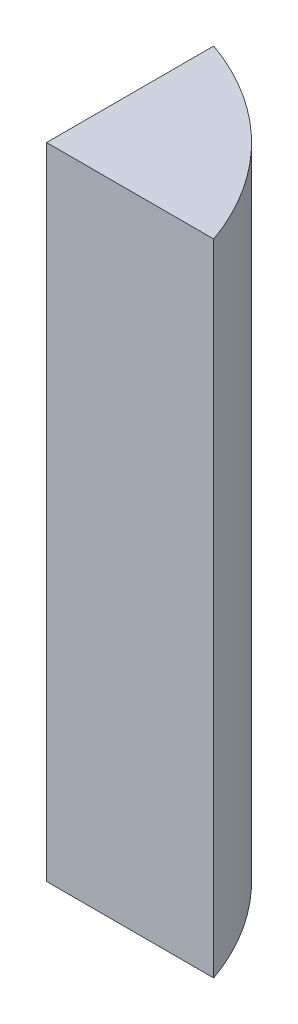
ISO-10303-21;
HEADER;
FILE_DESCRIPTION(('STEP AP214'),'2;1');
FILE_NAME('part.step','',(''),(''),'','','');
FILE_SCHEMA(('AUTOMOTIVE_DESIGN { 1 0 10303 214 1 1 1 1 }'));
ENDSEC;
DATA;
#1=APPLICATION_CONTEXT('core data for automotive mechanical design processes');
#2=APPLICATION_PROTOCOL_DEFINITION('international standard','automotive_design',2000,#1);
#3=PRODUCT_CONTEXT('',#1,'mechanical');
#4=PRODUCT('Part','Part','',(#3));
#5=PRODUCT_RELATED_PRODUCT_CATEGORY('part','',(#4));
#6=PRODUCT_DEFINITION_FORMATION('','',#4);
#7=PRODUCT_DEFINITION_CONTEXT('part definition',#1,'design');
#8=PRODUCT_DEFINITION('design','',#6,#7);
#9=PRODUCT_DEFINITION_SHAPE('','',#8);
#10=(LENGTH_UNIT() NAMED_UNIT(*) SI_UNIT(.MILLI.,.METRE.));
#11=(NAMED_UNIT(*) PLANE_ANGLE_UNIT() SI_UNIT($,.RADIAN.));
#12=(NAMED_UNIT(*) SI_UNIT($,.STERADIAN.) SOLID_ANGLE_UNIT());
#13=UNCERTAINTY_MEASURE_WITH_UNIT(LENGTH_MEASURE(1.E-05),#10,'distance_accuracy_value','');
#14=(GEOMETRIC_REPRESENTATION_CONTEXT(3) GLOBAL_UNCERTAINTY_ASSIGNED_CONTEXT((#13)) GLOBAL_UNIT_ASSIGNED_CONTEXT((#10,
#11,#12)) REPRESENTATION_CONTEXT('',''));
#15=CARTESIAN_POINT('',(0.,0.,0.));
#16=DIRECTION('',(0.,0.,1.));
#17=DIRECTION('',(1.,0.,0.));
#18=AXIS2_PLACEMENT_3D('',#15,#16,#17);
#19=CARTESIAN_POINT('',(0.,140.,-20.));
#20=DIRECTION('',(0.,0.,-1.));
#21=DIRECTION('',(-1.,0.,0.));
#22=AXIS2_PLACEMENT_3D('',#19,#20,#21);
#23=PLANE('',#22);
#24=DIRECTION('',(1.,0.,0.));
#25=VECTOR('',#24,1.);
#26=CARTESIAN_POINT('',(0.,0.,-20.));
#27=LINE('',#26,#25);
#28=CARTESIAN_POINT('',(20.,0.,-20.));
#29=VERTEX_POINT('',#28);
#30=CARTESIAN_POINT('',(56.5685424949238,0.,-20.));
#31=VERTEX_POINT('',#30);
#32=EDGE_CURVE('E84',#29,#31,#27,.T.);
#33=ORIENTED_EDGE('',*,*,#32,.T.);
#34=DIRECTION('',(0.,-1.,0.));
#35=VECTOR('',#34,1.);
#36=CARTESIAN_POINT('',(56.5685424949238,140.,-20.));
#37=LINE('',#36,#35);
#38=CARTESIAN_POINT('',(56.5685424949238,140.,-20.));
#39=VERTEX_POINT('',#38);
#40=EDGE_CURVE('E11',#39,#31,#37,.T.);
#41=ORIENTED_EDGE('',*,*,#40,.F.);
#42=DIRECTION('',(1.,0.,0.));
#43=VECTOR('',#42,1.);
#44=CARTESIAN_POINT('',(0.,140.,-20.));
#45=LINE('',#44,#43);
#46=CARTESIAN_POINT('',(20.,140.,-20.));
#47=VERTEX_POINT('',#46);
#48=EDGE_CURVE('E77',#47,#39,#45,.T.);
#49=ORIENTED_EDGE('',*,*,#48,.F.);
#50=DIRECTION('',(0.,-1.,0.));
#51=VECTOR('',#50,1.);
#52=CARTESIAN_POINT('',(20.,140.,-20.));
#53=LINE('',#52,#51);
#54=EDGE_CURVE('E85',#47,#29,#53,.T.);
#55=ORIENTED_EDGE('',*,*,#54,.T.);
#56=EDGE_LOOP('',(#33,#41,#49,#55));
#57=FACE_BOUND('',#56,.T.);
#58=ADVANCED_FACE('F37',(#57),#23,.F.);
#59=CARTESIAN_POINT('',(0.,140.,0.));
#60=DIRECTION('',(0.,-1.,0.));
#61=DIRECTION('',(0.,0.,-1.));
#62=AXIS2_PLACEMENT_3D('',#59,#60,#61);
#63=CYLINDRICAL_SURFACE('',#62,60.);
#64=CARTESIAN_POINT('',(0.,0.,0.));
#65=DIRECTION('',(0.,1.,0.));
#66=DIRECTION('',(0.,0.,1.));
#67=AXIS2_PLACEMENT_3D('',#64,#65,#66);
#68=CIRCLE('',#67,60.);
#69=CARTESIAN_POINT('',(20.,0.,-56.5685424949238));
#70=VERTEX_POINT('',#69);
#71=EDGE_CURVE('E65',#31,#70,#68,.T.);
#72=ORIENTED_EDGE('',*,*,#71,.T.);
#73=DIRECTION('',(0.,-1.,0.));
#74=VECTOR('',#73,1.);
#75=CARTESIAN_POINT('',(20.,140.,-56.5685424949238));
#76=LINE('',#75,#74);
#77=CARTESIAN_POINT('',(20.,140.,-56.5685424949238));
#78=VERTEX_POINT('',#77);
#79=EDGE_CURVE('E45',#78,#70,#76,.T.);
#80=ORIENTED_EDGE('',*,*,#79,.F.);
#81=CARTESIAN_POINT('',(0.,140.,0.));
#82=DIRECTION('',(0.,1.,0.));
#83=DIRECTION('',(0.,0.,1.));
#84=AXIS2_PLACEMENT_3D('',#81,#82,#83);
#85=CIRCLE('',#84,60.);
#86=EDGE_CURVE('E73',#39,#78,#85,.T.);
#87=ORIENTED_EDGE('',*,*,#86,.F.);
#88=ORIENTED_EDGE('',*,*,#40,.T.);
#89=EDGE_LOOP('',(#72,#80,#87,#88));
#90=FACE_BOUND('',#89,.T.);
#91=ADVANCED_FACE('F74',(#90),#63,.T.);
#92=CARTESIAN_POINT('',(20.,140.,0.));
#93=DIRECTION('',(1.,0.,0.));
#94=DIRECTION('',(0.,0.,-1.));
#95=AXIS2_PLACEMENT_3D('',#92,#93,#94);
#96=PLANE('',#95);
#97=DIRECTION('',(0.,0.,1.));
#98=VECTOR('',#97,1.);
#99=CARTESIAN_POINT('',(20.,0.,0.));
#100=LINE('',#99,#98);
#101=EDGE_CURVE('E70',#70,#29,#100,.T.);
#102=ORIENTED_EDGE('',*,*,#101,.T.);
#103=ORIENTED_EDGE('',*,*,#54,.F.);
#104=DIRECTION('',(0.,0.,1.));
#105=VECTOR('',#104,1.);
#106=CARTESIAN_POINT('',(20.,140.,0.));
#107=LINE('',#106,#105);
#108=EDGE_CURVE('E53',#78,#47,#107,.T.);
#109=ORIENTED_EDGE('',*,*,#108,.F.);
#110=ORIENTED_EDGE('',*,*,#79,.T.);
#111=EDGE_LOOP('',(#102,#103,#109,#110));
#112=FACE_BOUND('',#111,.T.);
#113=ADVANCED_FACE('F92',(#112),#96,.F.);
#114=CARTESIAN_POINT('',(0.,140.,0.));
#115=DIRECTION('',(0.,1.,0.));
#116=DIRECTION('',(0.,0.,1.));
#117=AXIS2_PLACEMENT_3D('',#114,#115,#116);
#118=PLANE('',#117);
#119=ORIENTED_EDGE('',*,*,#48,.T.);
#120=ORIENTED_EDGE('',*,*,#86,.T.);
#121=ORIENTED_EDGE('',*,*,#108,.T.);
#122=EDGE_LOOP('',(#119,#120,#121));
#123=FACE_BOUND('',#122,.T.);
#124=ADVANCED_FACE('F80',(#123),#118,.T.);
#125=CARTESIAN_POINT('',(0.,0.,0.));
#126=DIRECTION('',(0.,1.,0.));
#127=DIRECTION('',(0.,0.,1.));
#128=AXIS2_PLACEMENT_3D('',#125,#126,#127);
#129=PLANE('',#128);
#130=ORIENTED_EDGE('',*,*,#32,.F.);
#131=ORIENTED_EDGE('',*,*,#101,.F.);
#132=ORIENTED_EDGE('',*,*,#71,.F.);
#133=EDGE_LOOP('',(#130,#131,#132));
#134=FACE_BOUND('',#133,.T.);
#135=ADVANCED_FACE('F93',(#134),#129,.F.);
#136=CLOSED_SHELL('',(#58,#91,#113,#124,#135));
#137=MANIFOLD_SOLID_BREP('B2',#136);
#138=ADVANCED_BREP_SHAPE_REPRESENTATION('',(#18,#137),#14);
#139=SHAPE_DEFINITION_REPRESENTATION(#9,#138);
ENDSEC;
END-ISO-10303-21;
